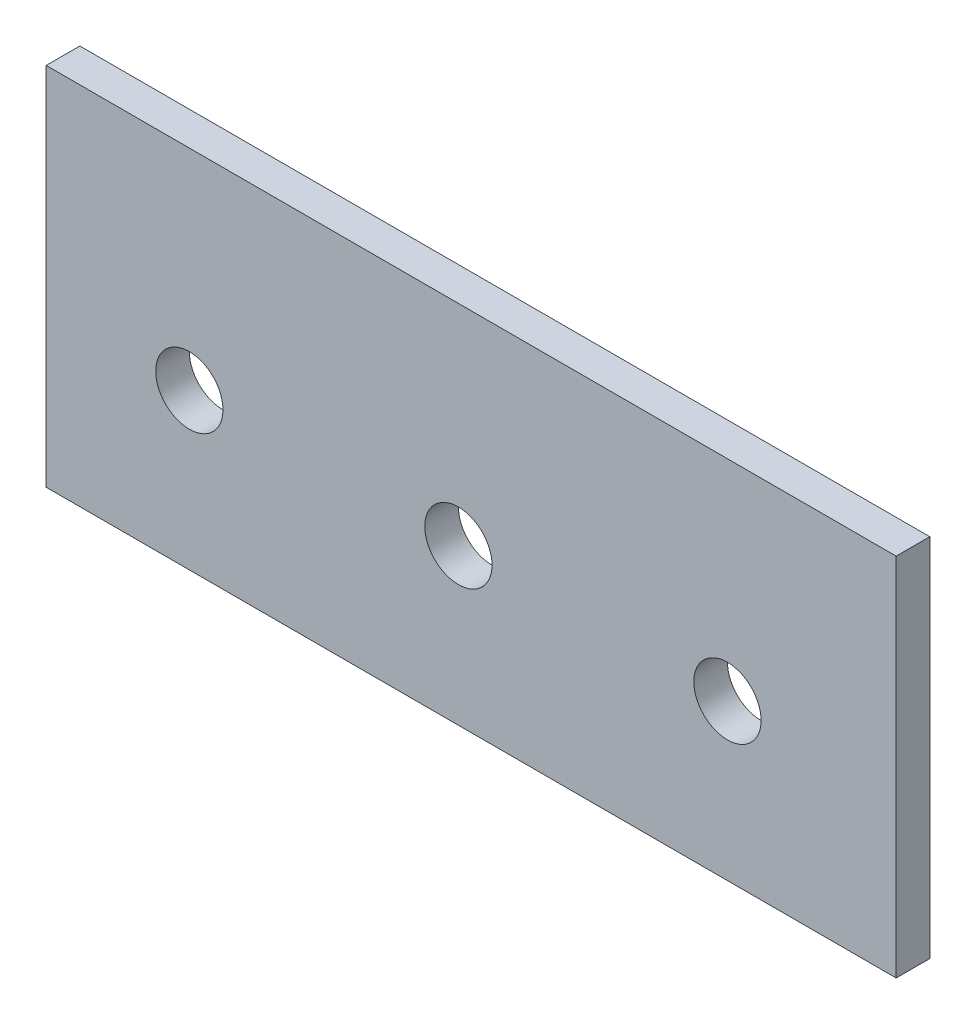
ISO-10303-21;
HEADER;
FILE_DESCRIPTION(('STEP AP214'),'2;1');
FILE_NAME('part.step','',(''),(''),'','','');
FILE_SCHEMA(('AUTOMOTIVE_DESIGN { 1 0 10303 214 1 1 1 1 }'));
ENDSEC;
DATA;
#1=APPLICATION_CONTEXT('core data for automotive mechanical design processes');
#2=APPLICATION_PROTOCOL_DEFINITION('international standard','automotive_design',2000,#1);
#3=PRODUCT_CONTEXT('',#1,'mechanical');
#4=PRODUCT('Part','Part','',(#3));
#5=PRODUCT_RELATED_PRODUCT_CATEGORY('part','',(#4));
#6=PRODUCT_DEFINITION_FORMATION('','',#4);
#7=PRODUCT_DEFINITION_CONTEXT('part definition',#1,'design');
#8=PRODUCT_DEFINITION('design','',#6,#7);
#9=PRODUCT_DEFINITION_SHAPE('','',#8);
#10=(LENGTH_UNIT() NAMED_UNIT(*) SI_UNIT(.MILLI.,.METRE.));
#11=(NAMED_UNIT(*) PLANE_ANGLE_UNIT() SI_UNIT($,.RADIAN.));
#12=(NAMED_UNIT(*) SI_UNIT($,.STERADIAN.) SOLID_ANGLE_UNIT());
#13=UNCERTAINTY_MEASURE_WITH_UNIT(LENGTH_MEASURE(1.E-05),#10,'distance_accuracy_value','');
#14=(GEOMETRIC_REPRESENTATION_CONTEXT(3) GLOBAL_UNCERTAINTY_ASSIGNED_CONTEXT((#13)) GLOBAL_UNIT_ASSIGNED_CONTEXT((#10,
#11,#12)) REPRESENTATION_CONTEXT('',''));
#15=CARTESIAN_POINT('',(0.,0.,0.));
#16=DIRECTION('',(0.,0.,1.));
#17=DIRECTION('',(1.,0.,0.));
#18=AXIS2_PLACEMENT_3D('',#15,#16,#17);
#19=CARTESIAN_POINT('',(0.,0.,3.175));
#20=DIRECTION('',(0.,0.,1.));
#21=DIRECTION('',(1.,0.,0.));
#22=AXIS2_PLACEMENT_3D('',#19,#20,#21);
#23=PLANE('',#22);
#24=CARTESIAN_POINT('',(-25.4,-2.22044604925031E-13,3.175));
#25=DIRECTION('',(0.,0.,1.));
#26=DIRECTION('',(1.,0.,0.));
#27=AXIS2_PLACEMENT_3D('',#24,#25,#26);
#28=CIRCLE('',#27,3.175);
#29=CARTESIAN_POINT('',(-22.225,-2.22044604925031E-13,3.175));
#30=VERTEX_POINT('',#29);
#31=EDGE_CURVE('E121',#30,#30,#28,.T.);
#32=ORIENTED_EDGE('',*,*,#31,.F.);
#33=EDGE_LOOP('',(#32));
#34=FACE_BOUND('',#33,.T.);
#35=DIRECTION('',(0.,-1.,0.));
#36=VECTOR('',#35,1.);
#37=CARTESIAN_POINT('',(-89.7107228609585,19.8132348722145,3.175));
#38=LINE('',#37,#36);
#39=CARTESIAN_POINT('',(-89.7107228609585,19.8132348722145,3.175));
#40=VERTEX_POINT('',#39);
#41=CARTESIAN_POINT('',(-89.7107228609585,-14.675554431808,3.175));
#42=VERTEX_POINT('',#41);
#43=EDGE_CURVE('E91',#40,#42,#38,.T.);
#44=ORIENTED_EDGE('',*,*,#43,.T.);
#45=DIRECTION('',(1.,0.,0.));
#46=VECTOR('',#45,1.);
#47=CARTESIAN_POINT('',(-89.7107228609585,-14.675554431808,3.175));
#48=LINE('',#47,#46);
#49=CARTESIAN_POINT('',(-9.47571594972063,-14.675554431808,3.175));
#50=VERTEX_POINT('',#49);
#51=EDGE_CURVE('E86',#42,#50,#48,.T.);
#52=ORIENTED_EDGE('',*,*,#51,.T.);
#53=DIRECTION('',(0.,1.,0.));
#54=VECTOR('',#53,1.);
#55=CARTESIAN_POINT('',(-9.47571594972063,19.8132348722145,3.175));
#56=LINE('',#55,#54);
#57=CARTESIAN_POINT('',(-9.47571594972063,19.8132348722145,3.175));
#58=VERTEX_POINT('',#57);
#59=EDGE_CURVE('E89',#50,#58,#56,.T.);
#60=ORIENTED_EDGE('',*,*,#59,.T.);
#61=DIRECTION('',(-1.,0.,0.));
#62=VECTOR('',#61,1.);
#63=CARTESIAN_POINT('',(-89.7107228609585,19.8132348722145,3.175));
#64=LINE('',#63,#62);
#65=EDGE_CURVE('E56',#58,#40,#64,.T.);
#66=ORIENTED_EDGE('',*,*,#65,.T.);
#67=EDGE_LOOP('',(#44,#52,#60,#66));
#68=FACE_BOUND('',#67,.T.);
#69=CARTESIAN_POINT('',(-76.2,-2.22044604925031E-13,3.175));
#70=DIRECTION('',(0.,0.,1.));
#71=DIRECTION('',(1.,0.,0.));
#72=AXIS2_PLACEMENT_3D('',#69,#70,#71);
#73=CIRCLE('',#72,3.175);
#74=CARTESIAN_POINT('',(-73.025,-2.22044604925031E-13,3.175));
#75=VERTEX_POINT('',#74);
#76=EDGE_CURVE('E106',#75,#75,#73,.T.);
#77=ORIENTED_EDGE('',*,*,#76,.F.);
#78=EDGE_LOOP('',(#77));
#79=FACE_BOUND('',#78,.T.);
#80=CARTESIAN_POINT('',(-50.8000000000001,0.,3.175));
#81=DIRECTION('',(0.,0.,1.));
#82=DIRECTION('',(1.,0.,0.));
#83=AXIS2_PLACEMENT_3D('',#80,#81,#82);
#84=CIRCLE('',#83,3.17499999999999);
#85=CARTESIAN_POINT('',(-47.6250000000001,0.,3.175));
#86=VERTEX_POINT('',#85);
#87=EDGE_CURVE('E127',#86,#86,#84,.T.);
#88=ORIENTED_EDGE('',*,*,#87,.F.);
#89=EDGE_LOOP('',(#88));
#90=FACE_BOUND('',#89,.T.);
#91=ADVANCED_FACE('F39',(#34,#68,#79,#90),#23,.T.);
#92=CARTESIAN_POINT('',(0.,0.,0.));
#93=DIRECTION('',(0.,0.,1.));
#94=DIRECTION('',(1.,0.,0.));
#95=AXIS2_PLACEMENT_3D('',#92,#93,#94);
#96=PLANE('',#95);
#97=DIRECTION('',(0.,-1.,0.));
#98=VECTOR('',#97,1.);
#99=CARTESIAN_POINT('',(-89.7107228609585,19.8132348722145,0.));
#100=LINE('',#99,#98);
#101=CARTESIAN_POINT('',(-89.7107228609585,19.8132348722145,0.));
#102=VERTEX_POINT('',#101);
#103=CARTESIAN_POINT('',(-89.7107228609585,-14.675554431808,0.));
#104=VERTEX_POINT('',#103);
#105=EDGE_CURVE('E103',#102,#104,#100,.T.);
#106=ORIENTED_EDGE('',*,*,#105,.F.);
#107=DIRECTION('',(-1.,0.,0.));
#108=VECTOR('',#107,1.);
#109=CARTESIAN_POINT('',(-89.7107228609585,19.8132348722145,0.));
#110=LINE('',#109,#108);
#111=CARTESIAN_POINT('',(-9.47571594972063,19.8132348722145,0.));
#112=VERTEX_POINT('',#111);
#113=EDGE_CURVE('E79',#112,#102,#110,.T.);
#114=ORIENTED_EDGE('',*,*,#113,.F.);
#115=DIRECTION('',(0.,1.,0.));
#116=VECTOR('',#115,1.);
#117=CARTESIAN_POINT('',(-9.47571594972063,19.8132348722145,0.));
#118=LINE('',#117,#116);
#119=CARTESIAN_POINT('',(-9.47571594972063,-14.675554431808,0.));
#120=VERTEX_POINT('',#119);
#121=EDGE_CURVE('E73',#120,#112,#118,.T.);
#122=ORIENTED_EDGE('',*,*,#121,.F.);
#123=DIRECTION('',(1.,0.,0.));
#124=VECTOR('',#123,1.);
#125=CARTESIAN_POINT('',(-89.7107228609585,-14.675554431808,0.));
#126=LINE('',#125,#124);
#127=EDGE_CURVE('E95',#104,#120,#126,.T.);
#128=ORIENTED_EDGE('',*,*,#127,.F.);
#129=EDGE_LOOP('',(#106,#114,#122,#128));
#130=FACE_BOUND('',#129,.T.);
#131=CARTESIAN_POINT('',(-76.2,-2.22044604925031E-13,0.));
#132=DIRECTION('',(0.,0.,1.));
#133=DIRECTION('',(1.,0.,0.));
#134=AXIS2_PLACEMENT_3D('',#131,#132,#133);
#135=CIRCLE('',#134,3.175);
#136=CARTESIAN_POINT('',(-73.025,-2.22044604925031E-13,0.));
#137=VERTEX_POINT('',#136);
#138=EDGE_CURVE('E118',#137,#137,#135,.T.);
#139=ORIENTED_EDGE('',*,*,#138,.T.);
#140=EDGE_LOOP('',(#139));
#141=FACE_BOUND('',#140,.T.);
#142=CARTESIAN_POINT('',(-25.4,-2.22044604925031E-13,0.));
#143=DIRECTION('',(0.,0.,1.));
#144=DIRECTION('',(1.,0.,0.));
#145=AXIS2_PLACEMENT_3D('',#142,#143,#144);
#146=CIRCLE('',#145,3.175);
#147=CARTESIAN_POINT('',(-22.225,-2.22044604925031E-13,0.));
#148=VERTEX_POINT('',#147);
#149=EDGE_CURVE('E124',#148,#148,#146,.T.);
#150=ORIENTED_EDGE('',*,*,#149,.T.);
#151=EDGE_LOOP('',(#150));
#152=FACE_BOUND('',#151,.T.);
#153=CARTESIAN_POINT('',(-50.8000000000001,0.,0.));
#154=DIRECTION('',(0.,0.,1.));
#155=DIRECTION('',(1.,0.,0.));
#156=AXIS2_PLACEMENT_3D('',#153,#154,#155);
#157=CIRCLE('',#156,3.17499999999999);
#158=CARTESIAN_POINT('',(-47.6250000000001,0.,0.));
#159=VERTEX_POINT('',#158);
#160=EDGE_CURVE('E130',#159,#159,#157,.T.);
#161=ORIENTED_EDGE('',*,*,#160,.T.);
#162=EDGE_LOOP('',(#161));
#163=FACE_BOUND('',#162,.T.);
#164=ADVANCED_FACE('F114',(#130,#141,#152,#163),#96,.F.);
#165=CARTESIAN_POINT('',(-89.7107228609585,19.8132348722145,3.175));
#166=DIRECTION('',(1.,0.,0.));
#167=DIRECTION('',(0.,0.,-1.));
#168=AXIS2_PLACEMENT_3D('',#165,#166,#167);
#169=PLANE('',#168);
#170=ORIENTED_EDGE('',*,*,#105,.T.);
#171=DIRECTION('',(0.,0.,-1.));
#172=VECTOR('',#171,1.);
#173=CARTESIAN_POINT('',(-89.7107228609585,-14.675554431808,3.175));
#174=LINE('',#173,#172);
#175=EDGE_CURVE('E11',#42,#104,#174,.T.);
#176=ORIENTED_EDGE('',*,*,#175,.F.);
#177=ORIENTED_EDGE('',*,*,#43,.F.);
#178=DIRECTION('',(0.,0.,-1.));
#179=VECTOR('',#178,1.);
#180=CARTESIAN_POINT('',(-89.7107228609585,19.8132348722145,3.175));
#181=LINE('',#180,#179);
#182=EDGE_CURVE('E99',#40,#102,#181,.T.);
#183=ORIENTED_EDGE('',*,*,#182,.T.);
#184=EDGE_LOOP('',(#170,#176,#177,#183));
#185=FACE_BOUND('',#184,.T.);
#186=ADVANCED_FACE('F41',(#185),#169,.F.);
#187=CARTESIAN_POINT('',(-89.7107228609585,-14.675554431808,3.175));
#188=DIRECTION('',(0.,1.,0.));
#189=DIRECTION('',(0.,0.,1.));
#190=AXIS2_PLACEMENT_3D('',#187,#188,#189);
#191=PLANE('',#190);
#192=ORIENTED_EDGE('',*,*,#127,.T.);
#193=DIRECTION('',(0.,0.,-1.));
#194=VECTOR('',#193,1.);
#195=CARTESIAN_POINT('',(-9.47571594972063,-14.675554431808,3.175));
#196=LINE('',#195,#194);
#197=EDGE_CURVE('E48',#50,#120,#196,.T.);
#198=ORIENTED_EDGE('',*,*,#197,.F.);
#199=ORIENTED_EDGE('',*,*,#51,.F.);
#200=ORIENTED_EDGE('',*,*,#175,.T.);
#201=EDGE_LOOP('',(#192,#198,#199,#200));
#202=FACE_BOUND('',#201,.T.);
#203=ADVANCED_FACE('F94',(#202),#191,.F.);
#204=CARTESIAN_POINT('',(-9.47571594972063,19.8132348722145,3.175));
#205=DIRECTION('',(-1.,0.,0.));
#206=DIRECTION('',(0.,0.,1.));
#207=AXIS2_PLACEMENT_3D('',#204,#205,#206);
#208=PLANE('',#207);
#209=ORIENTED_EDGE('',*,*,#121,.T.);
#210=DIRECTION('',(0.,0.,-1.));
#211=VECTOR('',#210,1.);
#212=CARTESIAN_POINT('',(-9.47571594972063,19.8132348722145,3.175));
#213=LINE('',#212,#211);
#214=EDGE_CURVE('E96',#58,#112,#213,.T.);
#215=ORIENTED_EDGE('',*,*,#214,.F.);
#216=ORIENTED_EDGE('',*,*,#59,.F.);
#217=ORIENTED_EDGE('',*,*,#197,.T.);
#218=EDGE_LOOP('',(#209,#215,#216,#217));
#219=FACE_BOUND('',#218,.T.);
#220=ADVANCED_FACE('F97',(#219),#208,.F.);
#221=CARTESIAN_POINT('',(-89.7107228609585,19.8132348722145,3.175));
#222=DIRECTION('',(0.,-1.,0.));
#223=DIRECTION('',(0.,0.,-1.));
#224=AXIS2_PLACEMENT_3D('',#221,#222,#223);
#225=PLANE('',#224);
#226=ORIENTED_EDGE('',*,*,#113,.T.);
#227=ORIENTED_EDGE('',*,*,#182,.F.);
#228=ORIENTED_EDGE('',*,*,#65,.F.);
#229=ORIENTED_EDGE('',*,*,#214,.T.);
#230=EDGE_LOOP('',(#226,#227,#228,#229));
#231=FACE_BOUND('',#230,.T.);
#232=ADVANCED_FACE('F111',(#231),#225,.F.);
#233=CARTESIAN_POINT('',(-76.2,-2.22044604925031E-13,3.175));
#234=DIRECTION('',(0.,0.,-1.));
#235=DIRECTION('',(-1.,0.,0.));
#236=AXIS2_PLACEMENT_3D('',#233,#234,#235);
#237=CYLINDRICAL_SURFACE('',#236,3.175);
#238=ORIENTED_EDGE('',*,*,#76,.T.);
#239=EDGE_LOOP('',(#238));
#240=FACE_BOUND('',#239,.T.);
#241=ORIENTED_EDGE('',*,*,#138,.F.);
#242=EDGE_LOOP('',(#241));
#243=FACE_BOUND('',#242,.T.);
#244=ADVANCED_FACE('F148',(#240,#243),#237,.F.);
#245=CARTESIAN_POINT('',(-25.4,-2.22044604925031E-13,3.175));
#246=DIRECTION('',(0.,0.,-1.));
#247=DIRECTION('',(-1.,0.,0.));
#248=AXIS2_PLACEMENT_3D('',#245,#246,#247);
#249=CYLINDRICAL_SURFACE('',#248,3.175);
#250=ORIENTED_EDGE('',*,*,#31,.T.);
#251=EDGE_LOOP('',(#250));
#252=FACE_BOUND('',#251,.T.);
#253=ORIENTED_EDGE('',*,*,#149,.F.);
#254=EDGE_LOOP('',(#253));
#255=FACE_BOUND('',#254,.T.);
#256=ADVANCED_FACE('F193',(#252,#255),#249,.F.);
#257=CARTESIAN_POINT('',(-50.8000000000001,0.,3.175));
#258=DIRECTION('',(0.,0.,-1.));
#259=DIRECTION('',(-1.,0.,0.));
#260=AXIS2_PLACEMENT_3D('',#257,#258,#259);
#261=CYLINDRICAL_SURFACE('',#260,3.17499999999999);
#262=ORIENTED_EDGE('',*,*,#87,.T.);
#263=EDGE_LOOP('',(#262));
#264=FACE_BOUND('',#263,.T.);
#265=ORIENTED_EDGE('',*,*,#160,.F.);
#266=EDGE_LOOP('',(#265));
#267=FACE_BOUND('',#266,.T.);
#268=ADVANCED_FACE('F136',(#264,#267),#261,.F.);
#269=CLOSED_SHELL('',(#91,#164,#186,#203,#220,#232,#244,#256,#268));
#270=MANIFOLD_SOLID_BREP('B2',#269);
#271=ADVANCED_BREP_SHAPE_REPRESENTATION('',(#18,#270),#14);
#272=SHAPE_DEFINITION_REPRESENTATION(#9,#271);
ENDSEC;
END-ISO-10303-21;
